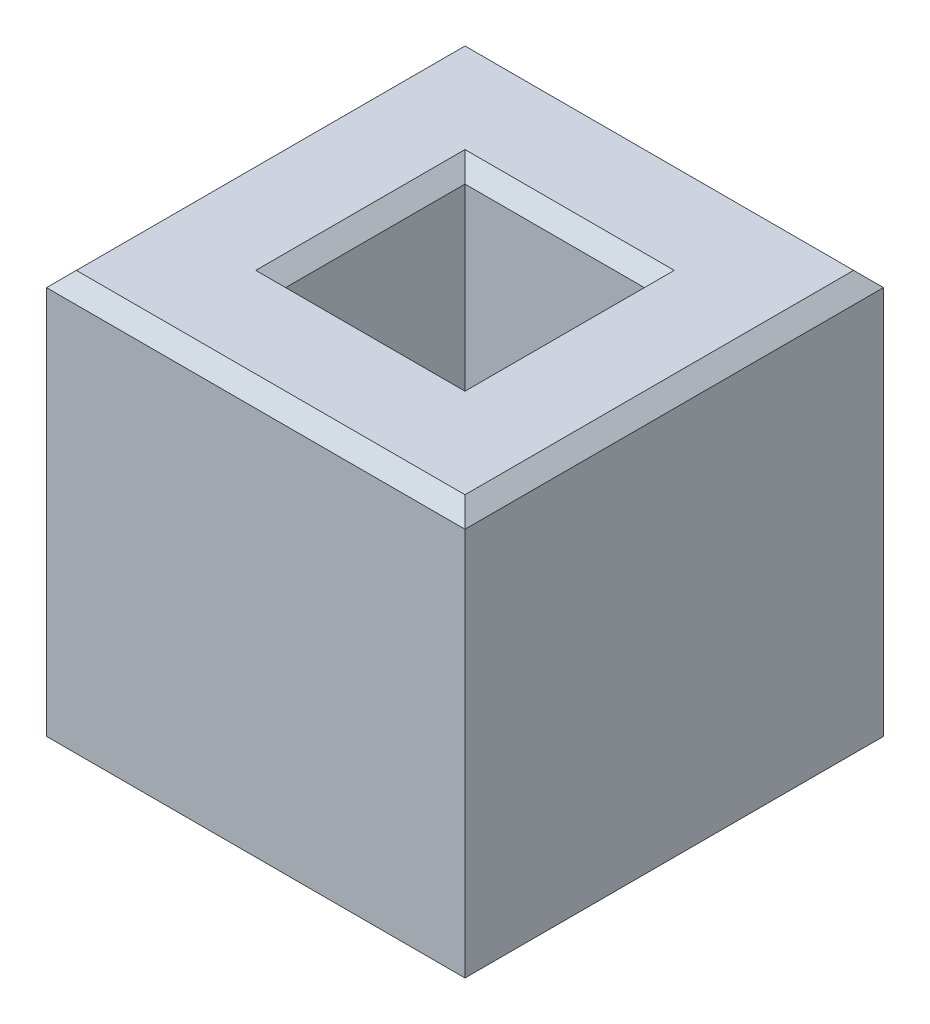
ISO-10303-21;
HEADER;
FILE_DESCRIPTION(('STEP AP214'),'2;1');
FILE_NAME('part.step','',(''),(''),'','','');
FILE_SCHEMA(('AUTOMOTIVE_DESIGN { 1 0 10303 214 1 1 1 1 }'));
ENDSEC;
DATA;
#1=APPLICATION_CONTEXT('core data for automotive mechanical design processes');
#2=APPLICATION_PROTOCOL_DEFINITION('international standard','automotive_design',2000,#1);
#3=PRODUCT_CONTEXT('',#1,'mechanical');
#4=PRODUCT('Part','Part','',(#3));
#5=PRODUCT_RELATED_PRODUCT_CATEGORY('part','',(#4));
#6=PRODUCT_DEFINITION_FORMATION('','',#4);
#7=PRODUCT_DEFINITION_CONTEXT('part definition',#1,'design');
#8=PRODUCT_DEFINITION('design','',#6,#7);
#9=PRODUCT_DEFINITION_SHAPE('','',#8);
#10=(LENGTH_UNIT() NAMED_UNIT(*) SI_UNIT(.MILLI.,.METRE.));
#11=(NAMED_UNIT(*) PLANE_ANGLE_UNIT() SI_UNIT($,.RADIAN.));
#12=(NAMED_UNIT(*) SI_UNIT($,.STERADIAN.) SOLID_ANGLE_UNIT());
#13=UNCERTAINTY_MEASURE_WITH_UNIT(LENGTH_MEASURE(1.E-05),#10,'distance_accuracy_value','');
#14=(GEOMETRIC_REPRESENTATION_CONTEXT(3) GLOBAL_UNCERTAINTY_ASSIGNED_CONTEXT((#13)) GLOBAL_UNIT_ASSIGNED_CONTEXT((#10,
#11,#12)) REPRESENTATION_CONTEXT('',''));
#15=CARTESIAN_POINT('',(0.,0.,0.));
#16=DIRECTION('',(0.,0.,1.));
#17=DIRECTION('',(1.,0.,0.));
#18=AXIS2_PLACEMENT_3D('',#15,#16,#17);
#19=CARTESIAN_POINT('',(88.9,177.8,88.9));
#20=DIRECTION('',(-1.,0.,0.));
#21=DIRECTION('',(0.,0.,1.));
#22=AXIS2_PLACEMENT_3D('',#19,#20,#21);
#23=PLANE('',#22);
#24=DIRECTION('',(0.,-1.,0.));
#25=VECTOR('',#24,1.);
#26=CARTESIAN_POINT('',(88.9,177.8,88.9));
#27=LINE('',#26,#25);
#28=CARTESIAN_POINT('',(88.9,171.45,88.9));
#29=VERTEX_POINT('',#28);
#30=CARTESIAN_POINT('',(88.9,6.34999999999997,88.9));
#31=VERTEX_POINT('',#30);
#32=EDGE_CURVE('E353',#29,#31,#27,.T.);
#33=ORIENTED_EDGE('',*,*,#32,.T.);
#34=DIRECTION('',(0.,0.,-1.));
#35=VECTOR('',#34,1.);
#36=CARTESIAN_POINT('',(88.9,6.34999999999997,-88.9));
#37=LINE('',#36,#35);
#38=CARTESIAN_POINT('',(88.9,6.34999999999997,-88.9));
#39=VERTEX_POINT('',#38);
#40=EDGE_CURVE('E308',#31,#39,#37,.T.);
#41=ORIENTED_EDGE('',*,*,#40,.T.);
#42=DIRECTION('',(0.,-1.,0.));
#43=VECTOR('',#42,1.);
#44=CARTESIAN_POINT('',(88.9,177.8,-88.9));
#45=LINE('',#44,#43);
#46=CARTESIAN_POINT('',(88.9,171.45,-88.9));
#47=VERTEX_POINT('',#46);
#48=EDGE_CURVE('E186',#47,#39,#45,.T.);
#49=ORIENTED_EDGE('',*,*,#48,.F.);
#50=DIRECTION('',(0.,0.,1.));
#51=VECTOR('',#50,1.);
#52=CARTESIAN_POINT('',(88.9,171.45,88.9));
#53=LINE('',#52,#51);
#54=EDGE_CURVE('E311',#47,#29,#53,.T.);
#55=ORIENTED_EDGE('',*,*,#54,.T.);
#56=EDGE_LOOP('',(#33,#41,#49,#55));
#57=FACE_BOUND('',#56,.T.);
#58=ADVANCED_FACE('F47',(#57),#23,.F.);
#59=CARTESIAN_POINT('',(-88.9,177.8,-88.9));
#60=DIRECTION('',(0.,0.,1.));
#61=DIRECTION('',(1.,0.,0.));
#62=AXIS2_PLACEMENT_3D('',#59,#60,#61);
#63=PLANE('',#62);
#64=ORIENTED_EDGE('',*,*,#48,.T.);
#65=DIRECTION('',(-1.,0.,0.));
#66=VECTOR('',#65,1.);
#67=CARTESIAN_POINT('',(-88.9,6.34999999999997,-88.9));
#68=LINE('',#67,#66);
#69=CARTESIAN_POINT('',(-88.9,6.34999999999997,-88.9));
#70=VERTEX_POINT('',#69);
#71=EDGE_CURVE('E184',#39,#70,#68,.T.);
#72=ORIENTED_EDGE('',*,*,#71,.T.);
#73=DIRECTION('',(0.,-1.,0.));
#74=VECTOR('',#73,1.);
#75=CARTESIAN_POINT('',(-88.9,177.8,-88.9));
#76=LINE('',#75,#74);
#77=CARTESIAN_POINT('',(-88.9,171.45,-88.9));
#78=VERTEX_POINT('',#77);
#79=EDGE_CURVE('E166',#78,#70,#76,.T.);
#80=ORIENTED_EDGE('',*,*,#79,.F.);
#81=DIRECTION('',(1.,0.,0.));
#82=VECTOR('',#81,1.);
#83=CARTESIAN_POINT('',(-88.9,171.45,-88.9));
#84=LINE('',#83,#82);
#85=EDGE_CURVE('E181',#78,#47,#84,.T.);
#86=ORIENTED_EDGE('',*,*,#85,.T.);
#87=EDGE_LOOP('',(#64,#72,#80,#86));
#88=FACE_BOUND('',#87,.T.);
#89=ADVANCED_FACE('F180',(#88),#63,.F.);
#90=CARTESIAN_POINT('',(-88.9,177.8,88.9));
#91=DIRECTION('',(1.,0.,0.));
#92=DIRECTION('',(0.,0.,-1.));
#93=AXIS2_PLACEMENT_3D('',#90,#91,#92);
#94=PLANE('',#93);
#95=ORIENTED_EDGE('',*,*,#79,.T.);
#96=DIRECTION('',(0.,0.,1.));
#97=VECTOR('',#96,1.);
#98=CARTESIAN_POINT('',(-88.9,6.34999999999997,88.9));
#99=LINE('',#98,#97);
#100=CARTESIAN_POINT('',(-88.9,6.34999999999997,88.9));
#101=VERTEX_POINT('',#100);
#102=EDGE_CURVE('E173',#70,#101,#99,.T.);
#103=ORIENTED_EDGE('',*,*,#102,.T.);
#104=DIRECTION('',(0.,-1.,0.));
#105=VECTOR('',#104,1.);
#106=CARTESIAN_POINT('',(-88.9,177.8,88.9));
#107=LINE('',#106,#105);
#108=CARTESIAN_POINT('',(-88.9,171.45,88.9));
#109=VERTEX_POINT('',#108);
#110=EDGE_CURVE('E168',#109,#101,#107,.T.);
#111=ORIENTED_EDGE('',*,*,#110,.F.);
#112=DIRECTION('',(0.,0.,-1.));
#113=VECTOR('',#112,1.);
#114=CARTESIAN_POINT('',(-88.9,171.45,88.9));
#115=LINE('',#114,#113);
#116=EDGE_CURVE('E163',#109,#78,#115,.T.);
#117=ORIENTED_EDGE('',*,*,#116,.T.);
#118=EDGE_LOOP('',(#95,#103,#111,#117));
#119=FACE_BOUND('',#118,.T.);
#120=ADVANCED_FACE('F165',(#119),#94,.F.);
#121=CARTESIAN_POINT('',(-88.9,177.8,88.9));
#122=DIRECTION('',(0.,0.,-1.));
#123=DIRECTION('',(-1.,0.,0.));
#124=AXIS2_PLACEMENT_3D('',#121,#122,#123);
#125=PLANE('',#124);
#126=ORIENTED_EDGE('',*,*,#110,.T.);
#127=DIRECTION('',(1.,0.,0.));
#128=VECTOR('',#127,1.);
#129=CARTESIAN_POINT('',(88.9,6.34999999999997,88.9));
#130=LINE('',#129,#128);
#131=EDGE_CURVE('E314',#101,#31,#130,.T.);
#132=ORIENTED_EDGE('',*,*,#131,.T.);
#133=ORIENTED_EDGE('',*,*,#32,.F.);
#134=DIRECTION('',(-1.,0.,0.));
#135=VECTOR('',#134,1.);
#136=CARTESIAN_POINT('',(-88.9,171.45,88.9));
#137=LINE('',#136,#135);
#138=EDGE_CURVE('E317',#29,#109,#137,.T.);
#139=ORIENTED_EDGE('',*,*,#138,.T.);
#140=EDGE_LOOP('',(#126,#132,#133,#139));
#141=FACE_BOUND('',#140,.T.);
#142=ADVANCED_FACE('F624',(#141),#125,.F.);
#143=CARTESIAN_POINT('',(0.,177.8,0.));
#144=DIRECTION('',(0.,-1.,0.));
#145=DIRECTION('',(0.,0.,-1.));
#146=AXIS2_PLACEMENT_3D('',#143,#144,#145);
#147=PLANE('',#146);
#148=DIRECTION('',(0.,0.,1.));
#149=VECTOR('',#148,1.);
#150=CARTESIAN_POINT('',(-82.5500000000001,177.8,0.));
#151=LINE('',#150,#149);
#152=CARTESIAN_POINT('',(-82.5500000000001,177.8,-82.5500000000001));
#153=VERTEX_POINT('',#152);
#154=CARTESIAN_POINT('',(-82.5500000000001,177.8,82.5500000000001));
#155=VERTEX_POINT('',#154);
#156=EDGE_CURVE('E58',#153,#155,#151,.T.);
#157=ORIENTED_EDGE('',*,*,#156,.T.);
#158=DIRECTION('',(1.,0.,0.));
#159=VECTOR('',#158,1.);
#160=CARTESIAN_POINT('',(0.,177.8,82.5500000000001));
#161=LINE('',#160,#159);
#162=CARTESIAN_POINT('',(82.5500000000001,177.8,82.5500000000001));
#163=VERTEX_POINT('',#162);
#164=EDGE_CURVE('E11',#155,#163,#161,.T.);
#165=ORIENTED_EDGE('',*,*,#164,.T.);
#166=DIRECTION('',(0.,0.,-1.));
#167=VECTOR('',#166,1.);
#168=CARTESIAN_POINT('',(82.5500000000001,177.8,0.));
#169=LINE('',#168,#167);
#170=CARTESIAN_POINT('',(82.5500000000001,177.8,-82.5500000000001));
#171=VERTEX_POINT('',#170);
#172=EDGE_CURVE('E266',#163,#171,#169,.T.);
#173=ORIENTED_EDGE('',*,*,#172,.T.);
#174=DIRECTION('',(-1.,0.,0.));
#175=VECTOR('',#174,1.);
#176=CARTESIAN_POINT('',(0.,177.8,-82.5500000000001));
#177=LINE('',#176,#175);
#178=EDGE_CURVE('E69',#171,#153,#177,.T.);
#179=ORIENTED_EDGE('',*,*,#178,.T.);
#180=EDGE_LOOP('',(#157,#165,#173,#179));
#181=FACE_BOUND('',#180,.T.);
#182=DIRECTION('',(-1.,0.,0.));
#183=VECTOR('',#182,1.);
#184=CARTESIAN_POINT('',(0.,177.8,44.45));
#185=LINE('',#184,#183);
#186=CARTESIAN_POINT('',(44.45,177.8,44.45));
#187=VERTEX_POINT('',#186);
#188=CARTESIAN_POINT('',(-44.45,177.8,44.45));
#189=VERTEX_POINT('',#188);
#190=EDGE_CURVE('E273',#187,#189,#185,.T.);
#191=ORIENTED_EDGE('',*,*,#190,.T.);
#192=DIRECTION('',(0.,0.,-1.));
#193=VECTOR('',#192,1.);
#194=CARTESIAN_POINT('',(-44.45,177.8,0.));
#195=LINE('',#194,#193);
#196=CARTESIAN_POINT('',(-44.45,177.8,-44.45));
#197=VERTEX_POINT('',#196);
#198=EDGE_CURVE('E269',#189,#197,#195,.T.);
#199=ORIENTED_EDGE('',*,*,#198,.T.);
#200=DIRECTION('',(1.,0.,0.));
#201=VECTOR('',#200,1.);
#202=CARTESIAN_POINT('',(0.,177.8,-44.45));
#203=LINE('',#202,#201);
#204=CARTESIAN_POINT('',(44.45,177.8,-44.45));
#205=VERTEX_POINT('',#204);
#206=EDGE_CURVE('E279',#197,#205,#203,.T.);
#207=ORIENTED_EDGE('',*,*,#206,.T.);
#208=DIRECTION('',(0.,0.,1.));
#209=VECTOR('',#208,1.);
#210=CARTESIAN_POINT('',(44.45,177.8,0.));
#211=LINE('',#210,#209);
#212=EDGE_CURVE('E276',#205,#187,#211,.T.);
#213=ORIENTED_EDGE('',*,*,#212,.T.);
#214=EDGE_LOOP('',(#191,#199,#207,#213));
#215=FACE_BOUND('',#214,.T.);
#216=ADVANCED_FACE('F615',(#181,#215),#147,.F.);
#217=CARTESIAN_POINT('',(0.,0.,0.));
#218=DIRECTION('',(0.,-1.,0.));
#219=DIRECTION('',(0.,0.,-1.));
#220=AXIS2_PLACEMENT_3D('',#217,#218,#219);
#221=PLANE('',#220);
#222=DIRECTION('',(0.,0.,-1.));
#223=VECTOR('',#222,1.);
#224=CARTESIAN_POINT('',(-82.55,0.,-88.9));
#225=LINE('',#224,#223);
#226=CARTESIAN_POINT('',(-82.55,0.,82.55));
#227=VERTEX_POINT('',#226);
#228=CARTESIAN_POINT('',(-82.55,0.,-82.55));
#229=VERTEX_POINT('',#228);
#230=EDGE_CURVE('E325',#227,#229,#225,.T.);
#231=ORIENTED_EDGE('',*,*,#230,.T.);
#232=DIRECTION('',(1.,0.,0.));
#233=VECTOR('',#232,1.);
#234=CARTESIAN_POINT('',(88.9,0.,-82.55));
#235=LINE('',#234,#233);
#236=CARTESIAN_POINT('',(82.55,0.,-82.55));
#237=VERTEX_POINT('',#236);
#238=EDGE_CURVE('E174',#229,#237,#235,.T.);
#239=ORIENTED_EDGE('',*,*,#238,.T.);
#240=DIRECTION('',(0.,0.,1.));
#241=VECTOR('',#240,1.);
#242=CARTESIAN_POINT('',(82.55,0.,88.9));
#243=LINE('',#242,#241);
#244=CARTESIAN_POINT('',(82.55,0.,82.55));
#245=VERTEX_POINT('',#244);
#246=EDGE_CURVE('E331',#237,#245,#243,.T.);
#247=ORIENTED_EDGE('',*,*,#246,.T.);
#248=DIRECTION('',(-1.,0.,0.));
#249=VECTOR('',#248,1.);
#250=CARTESIAN_POINT('',(-88.9,0.,82.55));
#251=LINE('',#250,#249);
#252=EDGE_CURVE('E328',#245,#227,#251,.T.);
#253=ORIENTED_EDGE('',*,*,#252,.T.);
#254=EDGE_LOOP('',(#231,#239,#247,#253));
#255=FACE_BOUND('',#254,.T.);
#256=DIRECTION('',(0.,0.,1.));
#257=VECTOR('',#256,1.);
#258=CARTESIAN_POINT('',(-44.45,0.,38.1));
#259=LINE('',#258,#257);
#260=CARTESIAN_POINT('',(-44.45,0.,-44.45));
#261=VERTEX_POINT('',#260);
#262=CARTESIAN_POINT('',(-44.45,0.,44.45));
#263=VERTEX_POINT('',#262);
#264=EDGE_CURVE('E338',#261,#263,#259,.T.);
#265=ORIENTED_EDGE('',*,*,#264,.T.);
#266=DIRECTION('',(1.,0.,0.));
#267=VECTOR('',#266,1.);
#268=CARTESIAN_POINT('',(38.1,0.,44.45));
#269=LINE('',#268,#267);
#270=CARTESIAN_POINT('',(44.45,0.,44.45));
#271=VERTEX_POINT('',#270);
#272=EDGE_CURVE('E334',#263,#271,#269,.T.);
#273=ORIENTED_EDGE('',*,*,#272,.T.);
#274=DIRECTION('',(0.,0.,-1.));
#275=VECTOR('',#274,1.);
#276=CARTESIAN_POINT('',(44.45,0.,-38.1));
#277=LINE('',#276,#275);
#278=CARTESIAN_POINT('',(44.45,0.,-44.45));
#279=VERTEX_POINT('',#278);
#280=EDGE_CURVE('E344',#271,#279,#277,.T.);
#281=ORIENTED_EDGE('',*,*,#280,.T.);
#282=DIRECTION('',(-1.,0.,0.));
#283=VECTOR('',#282,1.);
#284=CARTESIAN_POINT('',(-38.1,0.,-44.45));
#285=LINE('',#284,#283);
#286=EDGE_CURVE('E341',#279,#261,#285,.T.);
#287=ORIENTED_EDGE('',*,*,#286,.T.);
#288=EDGE_LOOP('',(#265,#273,#281,#287));
#289=FACE_BOUND('',#288,.T.);
#290=ADVANCED_FACE('F409',(#255,#289),#221,.T.);
#291=CARTESIAN_POINT('',(38.1,0.,38.1));
#292=DIRECTION('',(1.,0.,0.));
#293=DIRECTION('',(0.,0.,-1.));
#294=AXIS2_PLACEMENT_3D('',#291,#292,#293);
#295=PLANE('',#294);
#296=DIRECTION('',(0.,1.,0.));
#297=VECTOR('',#296,1.);
#298=CARTESIAN_POINT('',(38.1,0.,-38.1));
#299=LINE('',#298,#297);
#300=CARTESIAN_POINT('',(38.1,6.35000000000002,-38.1));
#301=VERTEX_POINT('',#300);
#302=CARTESIAN_POINT('',(38.1,171.45,-38.1));
#303=VERTEX_POINT('',#302);
#304=EDGE_CURVE('E252',#301,#303,#299,.T.);
#305=ORIENTED_EDGE('',*,*,#304,.F.);
#306=DIRECTION('',(0.,0.,1.));
#307=VECTOR('',#306,1.);
#308=CARTESIAN_POINT('',(38.1,6.35000000000002,38.1));
#309=LINE('',#308,#307);
#310=CARTESIAN_POINT('',(38.1,6.35000000000002,38.1));
#311=VERTEX_POINT('',#310);
#312=EDGE_CURVE('E282',#301,#311,#309,.T.);
#313=ORIENTED_EDGE('',*,*,#312,.T.);
#314=DIRECTION('',(0.,1.,0.));
#315=VECTOR('',#314,1.);
#316=CARTESIAN_POINT('',(38.1,0.,38.1));
#317=LINE('',#316,#315);
#318=CARTESIAN_POINT('',(38.1,171.45,38.1));
#319=VERTEX_POINT('',#318);
#320=EDGE_CURVE('E357',#311,#319,#317,.T.);
#321=ORIENTED_EDGE('',*,*,#320,.T.);
#322=DIRECTION('',(0.,0.,-1.));
#323=VECTOR('',#322,1.);
#324=CARTESIAN_POINT('',(38.1,171.45,38.1));
#325=LINE('',#324,#323);
#326=EDGE_CURVE('E285',#319,#303,#325,.T.);
#327=ORIENTED_EDGE('',*,*,#326,.T.);
#328=EDGE_LOOP('',(#305,#313,#321,#327));
#329=FACE_BOUND('',#328,.T.);
#330=ADVANCED_FACE('F375',(#329),#295,.F.);
#331=CARTESIAN_POINT('',(-38.1,0.,38.1));
#332=DIRECTION('',(0.,0.,1.));
#333=DIRECTION('',(1.,0.,0.));
#334=AXIS2_PLACEMENT_3D('',#331,#332,#333);
#335=PLANE('',#334);
#336=ORIENTED_EDGE('',*,*,#320,.F.);
#337=DIRECTION('',(-1.,0.,0.));
#338=VECTOR('',#337,1.);
#339=CARTESIAN_POINT('',(-38.1,6.35000000000002,38.1));
#340=LINE('',#339,#338);
#341=CARTESIAN_POINT('',(-38.1,6.35000000000002,38.1));
#342=VERTEX_POINT('',#341);
#343=EDGE_CURVE('E301',#311,#342,#340,.T.);
#344=ORIENTED_EDGE('',*,*,#343,.T.);
#345=DIRECTION('',(0.,1.,0.));
#346=VECTOR('',#345,1.);
#347=CARTESIAN_POINT('',(-38.1,0.,38.1));
#348=LINE('',#347,#346);
#349=CARTESIAN_POINT('',(-38.1,171.45,38.1));
#350=VERTEX_POINT('',#349);
#351=EDGE_CURVE('E365',#342,#350,#348,.T.);
#352=ORIENTED_EDGE('',*,*,#351,.T.);
#353=DIRECTION('',(1.,0.,0.));
#354=VECTOR('',#353,1.);
#355=CARTESIAN_POINT('',(-38.1,171.45,38.1));
#356=LINE('',#355,#354);
#357=EDGE_CURVE('E305',#350,#319,#356,.T.);
#358=ORIENTED_EDGE('',*,*,#357,.T.);
#359=EDGE_LOOP('',(#336,#344,#352,#358));
#360=FACE_BOUND('',#359,.T.);
#361=ADVANCED_FACE('F397',(#360),#335,.F.);
#362=CARTESIAN_POINT('',(-38.1,0.,38.1));
#363=DIRECTION('',(-1.,0.,0.));
#364=DIRECTION('',(0.,0.,1.));
#365=AXIS2_PLACEMENT_3D('',#362,#363,#364);
#366=PLANE('',#365);
#367=ORIENTED_EDGE('',*,*,#351,.F.);
#368=DIRECTION('',(0.,0.,-1.));
#369=VECTOR('',#368,1.);
#370=CARTESIAN_POINT('',(-38.1,6.35000000000002,-38.1));
#371=LINE('',#370,#369);
#372=CARTESIAN_POINT('',(-38.1,6.35000000000002,-38.1));
#373=VERTEX_POINT('',#372);
#374=EDGE_CURVE('E294',#342,#373,#371,.T.);
#375=ORIENTED_EDGE('',*,*,#374,.T.);
#376=DIRECTION('',(0.,1.,0.));
#377=VECTOR('',#376,1.);
#378=CARTESIAN_POINT('',(-38.1,0.,-38.1));
#379=LINE('',#378,#377);
#380=CARTESIAN_POINT('',(-38.1,171.45,-38.1));
#381=VERTEX_POINT('',#380);
#382=EDGE_CURVE('E361',#373,#381,#379,.T.);
#383=ORIENTED_EDGE('',*,*,#382,.T.);
#384=DIRECTION('',(0.,0.,1.));
#385=VECTOR('',#384,1.);
#386=CARTESIAN_POINT('',(-38.1,171.45,38.1));
#387=LINE('',#386,#385);
#388=EDGE_CURVE('E297',#381,#350,#387,.T.);
#389=ORIENTED_EDGE('',*,*,#388,.T.);
#390=EDGE_LOOP('',(#367,#375,#383,#389));
#391=FACE_BOUND('',#390,.T.);
#392=ADVANCED_FACE('F390',(#391),#366,.F.);
#393=CARTESIAN_POINT('',(-38.1,0.,-38.1));
#394=DIRECTION('',(0.,0.,-1.));
#395=DIRECTION('',(-1.,0.,0.));
#396=AXIS2_PLACEMENT_3D('',#393,#394,#395);
#397=PLANE('',#396);
#398=ORIENTED_EDGE('',*,*,#382,.F.);
#399=DIRECTION('',(1.,0.,0.));
#400=VECTOR('',#399,1.);
#401=CARTESIAN_POINT('',(38.1,6.35000000000002,-38.1));
#402=LINE('',#401,#400);
#403=EDGE_CURVE('E288',#373,#301,#402,.T.);
#404=ORIENTED_EDGE('',*,*,#403,.T.);
#405=ORIENTED_EDGE('',*,*,#304,.T.);
#406=DIRECTION('',(-1.,0.,0.));
#407=VECTOR('',#406,1.);
#408=CARTESIAN_POINT('',(-38.1,171.45,-38.1));
#409=LINE('',#408,#407);
#410=EDGE_CURVE('E291',#303,#381,#409,.T.);
#411=ORIENTED_EDGE('',*,*,#410,.T.);
#412=EDGE_LOOP('',(#398,#404,#405,#411));
#413=FACE_BOUND('',#412,.T.);
#414=ADVANCED_FACE('F385',(#413),#397,.F.);
#415=CARTESIAN_POINT('',(-88.9,6.34999999999997,88.9));
#416=DIRECTION('',(0.,-0.707106781186548,0.707106781186548));
#417=DIRECTION('',(-1.,0.,0.));
#418=AXIS2_PLACEMENT_3D('',#415,#416,#417);
#419=PLANE('',#418);
#420=DIRECTION('',(0.577350269189626,-0.577350269189626,-0.577350269189626));
#421=VECTOR('',#420,1.);
#422=CARTESIAN_POINT('',(-88.9,6.34999999999997,88.9));
#423=LINE('',#422,#421);
#424=EDGE_CURVE('E253',#227,#101,#423,.F.);
#425=ORIENTED_EDGE('',*,*,#424,.F.);
#426=ORIENTED_EDGE('',*,*,#252,.F.);
#427=DIRECTION('',(-0.577350269189626,-0.577350269189626,-0.577350269189626));
#428=VECTOR('',#427,1.);
#429=CARTESIAN_POINT('',(88.9,6.34999999999997,88.9));
#430=LINE('',#429,#428);
#431=EDGE_CURVE('E248',#31,#245,#430,.T.);
#432=ORIENTED_EDGE('',*,*,#431,.F.);
#433=ORIENTED_EDGE('',*,*,#131,.F.);
#434=EDGE_LOOP('',(#425,#426,#432,#433));
#435=FACE_BOUND('',#434,.T.);
#436=ADVANCED_FACE('F454',(#435),#419,.T.);
#437=CARTESIAN_POINT('',(88.9,6.34999999999997,88.9));
#438=DIRECTION('',(0.707106781186548,-0.707106781186548,0.));
#439=DIRECTION('',(0.,0.,1.));
#440=AXIS2_PLACEMENT_3D('',#437,#438,#439);
#441=PLANE('',#440);
#442=ORIENTED_EDGE('',*,*,#431,.T.);
#443=ORIENTED_EDGE('',*,*,#246,.F.);
#444=DIRECTION('',(0.577350269189626,0.577350269189626,-0.577350269189626));
#445=VECTOR('',#444,1.);
#446=CARTESIAN_POINT('',(29.6333333333333,-52.9166666666667,-29.6333333333333));
#447=LINE('',#446,#445);
#448=EDGE_CURVE('E257',#39,#237,#447,.F.);
#449=ORIENTED_EDGE('',*,*,#448,.F.);
#450=ORIENTED_EDGE('',*,*,#40,.F.);
#451=EDGE_LOOP('',(#442,#443,#449,#450));
#452=FACE_BOUND('',#451,.T.);
#453=ADVANCED_FACE('F447',(#452),#441,.T.);
#454=CARTESIAN_POINT('',(-88.9,6.34999999999997,88.9));
#455=DIRECTION('',(-0.707106781186548,-0.707106781186548,0.));
#456=DIRECTION('',(0.,0.,-1.));
#457=AXIS2_PLACEMENT_3D('',#454,#455,#456);
#458=PLANE('',#457);
#459=ORIENTED_EDGE('',*,*,#424,.T.);
#460=ORIENTED_EDGE('',*,*,#102,.F.);
#461=DIRECTION('',(0.577350269189626,-0.577350269189626,0.577350269189626));
#462=VECTOR('',#461,1.);
#463=CARTESIAN_POINT('',(-29.6333333333333,-52.9166666666667,-29.6333333333333));
#464=LINE('',#463,#462);
#465=EDGE_CURVE('E241',#229,#70,#464,.F.);
#466=ORIENTED_EDGE('',*,*,#465,.F.);
#467=ORIENTED_EDGE('',*,*,#230,.F.);
#468=EDGE_LOOP('',(#459,#460,#466,#467));
#469=FACE_BOUND('',#468,.T.);
#470=ADVANCED_FACE('F424',(#469),#458,.T.);
#471=CARTESIAN_POINT('',(-88.9,6.34999999999997,-88.9));
#472=DIRECTION('',(0.,-0.707106781186548,-0.707106781186548));
#473=DIRECTION('',(1.,0.,0.));
#474=AXIS2_PLACEMENT_3D('',#471,#472,#473);
#475=PLANE('',#474);
#476=ORIENTED_EDGE('',*,*,#448,.T.);
#477=ORIENTED_EDGE('',*,*,#238,.F.);
#478=ORIENTED_EDGE('',*,*,#465,.T.);
#479=ORIENTED_EDGE('',*,*,#71,.F.);
#480=EDGE_LOOP('',(#476,#477,#478,#479));
#481=FACE_BOUND('',#480,.T.);
#482=ADVANCED_FACE('F417',(#481),#475,.T.);
#483=CARTESIAN_POINT('',(0.,0.,-44.45));
#484=DIRECTION('',(0.,-0.707106781186546,0.707106781186549));
#485=DIRECTION('',(1.,0.,0.));
#486=AXIS2_PLACEMENT_3D('',#483,#484,#485);
#487=PLANE('',#486);
#488=DIRECTION('',(0.577350269189625,-0.577350269189628,-0.577350269189625));
#489=VECTOR('',#488,1.);
#490=CARTESIAN_POINT('',(29.6333333333334,14.8166666666667,-29.6333333333334));
#491=LINE('',#490,#489);
#492=EDGE_CURVE('E242',#301,#279,#491,.T.);
#493=ORIENTED_EDGE('',*,*,#492,.F.);
#494=ORIENTED_EDGE('',*,*,#403,.F.);
#495=DIRECTION('',(-0.577350269189625,-0.577350269189628,-0.577350269189625));
#496=VECTOR('',#495,1.);
#497=CARTESIAN_POINT('',(-29.6333333333334,14.8166666666667,-29.6333333333334));
#498=LINE('',#497,#496);
#499=EDGE_CURVE('E237',#261,#373,#498,.F.);
#500=ORIENTED_EDGE('',*,*,#499,.F.);
#501=ORIENTED_EDGE('',*,*,#286,.F.);
#502=EDGE_LOOP('',(#493,#494,#500,#501));
#503=FACE_BOUND('',#502,.T.);
#504=ADVANCED_FACE('F415',(#503),#487,.T.);
#505=CARTESIAN_POINT('',(-44.45,0.,0.));
#506=DIRECTION('',(0.707106781186549,-0.707106781186546,0.));
#507=DIRECTION('',(0.,0.,-1.));
#508=AXIS2_PLACEMENT_3D('',#505,#506,#507);
#509=PLANE('',#508);
#510=ORIENTED_EDGE('',*,*,#499,.T.);
#511=ORIENTED_EDGE('',*,*,#374,.F.);
#512=DIRECTION('',(-0.577350269189625,-0.577350269189628,0.577350269189625));
#513=VECTOR('',#512,1.);
#514=CARTESIAN_POINT('',(-29.6333333333334,14.8166666666667,29.6333333333334));
#515=LINE('',#514,#513);
#516=EDGE_CURVE('E203',#263,#342,#515,.F.);
#517=ORIENTED_EDGE('',*,*,#516,.F.);
#518=ORIENTED_EDGE('',*,*,#264,.F.);
#519=EDGE_LOOP('',(#510,#511,#517,#518));
#520=FACE_BOUND('',#519,.T.);
#521=ADVANCED_FACE('F413',(#520),#509,.T.);
#522=CARTESIAN_POINT('',(44.45,0.,0.));
#523=DIRECTION('',(-0.707106781186549,-0.707106781186546,0.));
#524=DIRECTION('',(0.,0.,1.));
#525=AXIS2_PLACEMENT_3D('',#522,#523,#524);
#526=PLANE('',#525);
#527=ORIENTED_EDGE('',*,*,#492,.T.);
#528=ORIENTED_EDGE('',*,*,#280,.F.);
#529=DIRECTION('',(-0.577350269189625,0.577350269189628,-0.577350269189625));
#530=VECTOR('',#529,1.);
#531=CARTESIAN_POINT('',(29.6333333333334,14.8166666666667,29.6333333333334));
#532=LINE('',#531,#530);
#533=EDGE_CURVE('E199',#311,#271,#532,.F.);
#534=ORIENTED_EDGE('',*,*,#533,.F.);
#535=ORIENTED_EDGE('',*,*,#312,.F.);
#536=EDGE_LOOP('',(#527,#528,#534,#535));
#537=FACE_BOUND('',#536,.T.);
#538=ADVANCED_FACE('F405',(#537),#526,.T.);
#539=CARTESIAN_POINT('',(0.,0.,44.45));
#540=DIRECTION('',(0.,-0.707106781186546,-0.707106781186549));
#541=DIRECTION('',(-1.,0.,0.));
#542=AXIS2_PLACEMENT_3D('',#539,#540,#541);
#543=PLANE('',#542);
#544=ORIENTED_EDGE('',*,*,#516,.T.);
#545=ORIENTED_EDGE('',*,*,#343,.F.);
#546=ORIENTED_EDGE('',*,*,#533,.T.);
#547=ORIENTED_EDGE('',*,*,#272,.F.);
#548=EDGE_LOOP('',(#544,#545,#546,#547));
#549=FACE_BOUND('',#548,.T.);
#550=ADVANCED_FACE('F400',(#549),#543,.T.);
#551=CARTESIAN_POINT('',(0.,177.8,-82.5500000000001));
#552=DIRECTION('',(0.,-0.707106781186544,0.707106781186551));
#553=DIRECTION('',(-1.,0.,0.));
#554=AXIS2_PLACEMENT_3D('',#551,#552,#553);
#555=PLANE('',#554);
#556=DIRECTION('',(-0.577350269189624,0.577350269189629,0.577350269189624));
#557=VECTOR('',#556,1.);
#558=CARTESIAN_POINT('',(55.0333333333335,205.316666666667,-55.0333333333335));
#559=LINE('',#558,#557);
#560=EDGE_CURVE('E193',#47,#171,#559,.T.);
#561=ORIENTED_EDGE('',*,*,#560,.F.);
#562=ORIENTED_EDGE('',*,*,#85,.F.);
#563=DIRECTION('',(0.577350269189624,0.577350269189629,0.577350269189624));
#564=VECTOR('',#563,1.);
#565=CARTESIAN_POINT('',(-55.0333333333335,205.316666666667,-55.0333333333335));
#566=LINE('',#565,#564);
#567=EDGE_CURVE('E191',#153,#78,#566,.F.);
#568=ORIENTED_EDGE('',*,*,#567,.F.);
#569=ORIENTED_EDGE('',*,*,#178,.F.);
#570=EDGE_LOOP('',(#561,#562,#568,#569));
#571=FACE_BOUND('',#570,.T.);
#572=ADVANCED_FACE('F190',(#571),#555,.F.);
#573=CARTESIAN_POINT('',(-82.5500000000001,177.8,0.));
#574=DIRECTION('',(0.707106781186551,-0.707106781186544,0.));
#575=DIRECTION('',(0.,0.,1.));
#576=AXIS2_PLACEMENT_3D('',#573,#574,#575);
#577=PLANE('',#576);
#578=ORIENTED_EDGE('',*,*,#567,.T.);
#579=ORIENTED_EDGE('',*,*,#116,.F.);
#580=DIRECTION('',(0.577350269189624,0.577350269189629,-0.577350269189624));
#581=VECTOR('',#580,1.);
#582=CARTESIAN_POINT('',(-55.0333333333335,205.316666666667,55.0333333333335));
#583=LINE('',#582,#581);
#584=EDGE_CURVE('E205',#155,#109,#583,.F.);
#585=ORIENTED_EDGE('',*,*,#584,.F.);
#586=ORIENTED_EDGE('',*,*,#156,.F.);
#587=EDGE_LOOP('',(#578,#579,#585,#586));
#588=FACE_BOUND('',#587,.T.);
#589=ADVANCED_FACE('F197',(#588),#577,.F.);
#590=CARTESIAN_POINT('',(82.5500000000001,177.8,0.));
#591=DIRECTION('',(-0.707106781186551,-0.707106781186544,0.));
#592=DIRECTION('',(0.,0.,-1.));
#593=AXIS2_PLACEMENT_3D('',#590,#591,#592);
#594=PLANE('',#593);
#595=ORIENTED_EDGE('',*,*,#560,.T.);
#596=ORIENTED_EDGE('',*,*,#172,.F.);
#597=DIRECTION('',(0.577350269189624,-0.577350269189629,0.577350269189624));
#598=VECTOR('',#597,1.);
#599=CARTESIAN_POINT('',(55.0333333333335,205.316666666667,55.0333333333335));
#600=LINE('',#599,#598);
#601=EDGE_CURVE('E223',#29,#163,#600,.F.);
#602=ORIENTED_EDGE('',*,*,#601,.F.);
#603=ORIENTED_EDGE('',*,*,#54,.F.);
#604=EDGE_LOOP('',(#595,#596,#602,#603));
#605=FACE_BOUND('',#604,.T.);
#606=ADVANCED_FACE('F499',(#605),#594,.F.);
#607=CARTESIAN_POINT('',(0.,177.8,82.5500000000001));
#608=DIRECTION('',(0.,-0.707106781186544,-0.707106781186551));
#609=DIRECTION('',(1.,0.,0.));
#610=AXIS2_PLACEMENT_3D('',#607,#608,#609);
#611=PLANE('',#610);
#612=ORIENTED_EDGE('',*,*,#584,.T.);
#613=ORIENTED_EDGE('',*,*,#138,.F.);
#614=ORIENTED_EDGE('',*,*,#601,.T.);
#615=ORIENTED_EDGE('',*,*,#164,.F.);
#616=EDGE_LOOP('',(#612,#613,#614,#615));
#617=FACE_BOUND('',#616,.T.);
#618=ADVANCED_FACE('F507',(#617),#611,.F.);
#619=CARTESIAN_POINT('',(44.45,177.8,0.));
#620=DIRECTION('',(0.707106781186549,-0.707106781186546,0.));
#621=DIRECTION('',(0.,0.,1.));
#622=AXIS2_PLACEMENT_3D('',#619,#620,#621);
#623=PLANE('',#622);
#624=DIRECTION('',(0.577350269189625,0.577350269189628,-0.577350269189625));
#625=VECTOR('',#624,1.);
#626=CARTESIAN_POINT('',(29.6333333333334,162.983333333333,-29.6333333333334));
#627=LINE('',#626,#625);
#628=EDGE_CURVE('E214',#303,#205,#627,.T.);
#629=ORIENTED_EDGE('',*,*,#628,.F.);
#630=ORIENTED_EDGE('',*,*,#326,.F.);
#631=DIRECTION('',(0.577350269189625,0.577350269189628,0.577350269189625));
#632=VECTOR('',#631,1.);
#633=CARTESIAN_POINT('',(29.6333333333334,162.983333333333,29.6333333333334));
#634=LINE('',#633,#632);
#635=EDGE_CURVE('E52',#187,#319,#634,.F.);
#636=ORIENTED_EDGE('',*,*,#635,.F.);
#637=ORIENTED_EDGE('',*,*,#212,.F.);
#638=EDGE_LOOP('',(#629,#630,#636,#637));
#639=FACE_BOUND('',#638,.T.);
#640=ADVANCED_FACE('F50',(#639),#623,.F.);
#641=CARTESIAN_POINT('',(0.,177.8,44.45));
#642=DIRECTION('',(0.,-0.707106781186546,0.707106781186549));
#643=DIRECTION('',(-1.,0.,0.));
#644=AXIS2_PLACEMENT_3D('',#641,#642,#643);
#645=PLANE('',#644);
#646=ORIENTED_EDGE('',*,*,#635,.T.);
#647=ORIENTED_EDGE('',*,*,#357,.F.);
#648=DIRECTION('',(-0.577350269189625,0.577350269189628,0.577350269189625));
#649=VECTOR('',#648,1.);
#650=CARTESIAN_POINT('',(-29.6333333333334,162.983333333333,29.6333333333334));
#651=LINE('',#650,#649);
#652=EDGE_CURVE('E212',#189,#350,#651,.F.);
#653=ORIENTED_EDGE('',*,*,#652,.F.);
#654=ORIENTED_EDGE('',*,*,#190,.F.);
#655=EDGE_LOOP('',(#646,#647,#653,#654));
#656=FACE_BOUND('',#655,.T.);
#657=ADVANCED_FACE('F396',(#656),#645,.F.);
#658=CARTESIAN_POINT('',(0.,177.8,-44.45));
#659=DIRECTION('',(0.,-0.707106781186546,-0.707106781186549));
#660=DIRECTION('',(1.,0.,0.));
#661=AXIS2_PLACEMENT_3D('',#658,#659,#660);
#662=PLANE('',#661);
#663=ORIENTED_EDGE('',*,*,#628,.T.);
#664=ORIENTED_EDGE('',*,*,#206,.F.);
#665=DIRECTION('',(0.577350269189625,-0.577350269189628,0.577350269189625));
#666=VECTOR('',#665,1.);
#667=CARTESIAN_POINT('',(-29.6333333333334,162.983333333333,-29.6333333333334));
#668=LINE('',#667,#666);
#669=EDGE_CURVE('E209',#381,#197,#668,.F.);
#670=ORIENTED_EDGE('',*,*,#669,.F.);
#671=ORIENTED_EDGE('',*,*,#410,.F.);
#672=EDGE_LOOP('',(#663,#664,#670,#671));
#673=FACE_BOUND('',#672,.T.);
#674=ADVANCED_FACE('F382',(#673),#662,.F.);
#675=CARTESIAN_POINT('',(-44.45,177.8,0.));
#676=DIRECTION('',(-0.707106781186549,-0.707106781186546,0.));
#677=DIRECTION('',(0.,0.,-1.));
#678=AXIS2_PLACEMENT_3D('',#675,#676,#677);
#679=PLANE('',#678);
#680=ORIENTED_EDGE('',*,*,#652,.T.);
#681=ORIENTED_EDGE('',*,*,#388,.F.);
#682=ORIENTED_EDGE('',*,*,#669,.T.);
#683=ORIENTED_EDGE('',*,*,#198,.F.);
#684=EDGE_LOOP('',(#680,#681,#682,#683));
#685=FACE_BOUND('',#684,.T.);
#686=ADVANCED_FACE('F393',(#685),#679,.F.);
#687=CLOSED_SHELL('',(#58,#89,#120,#142,#216,#290,#330,#361,#392,#414,#436,#453,#470,#482,#504,
#521,#538,#550,#572,#589,#606,#618,#640,#657,#674,#686));
#688=MANIFOLD_SOLID_BREP('B2',#687);
#689=ADVANCED_BREP_SHAPE_REPRESENTATION('',(#18,#688),#14);
#690=SHAPE_DEFINITION_REPRESENTATION(#9,#689);
ENDSEC;
END-ISO-10303-21;
